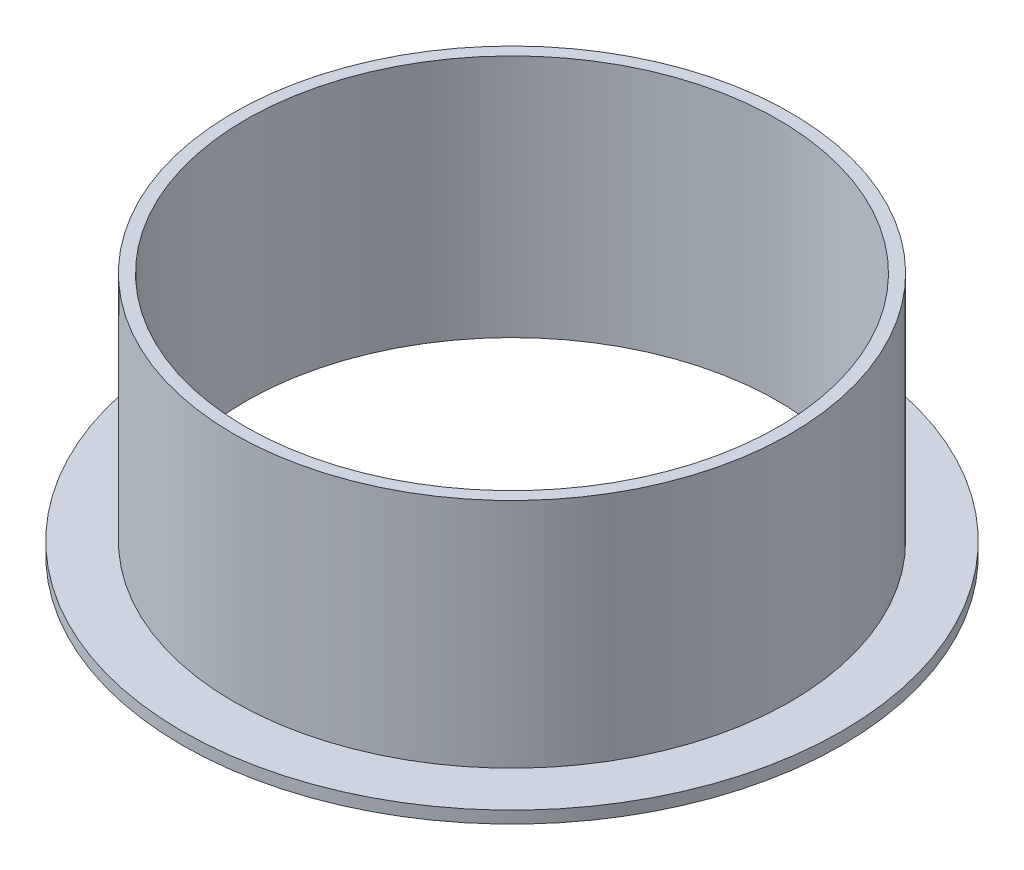
ISO-10303-21;
HEADER;
FILE_DESCRIPTION(('STEP AP214'),'2;1');
FILE_NAME('part.step','',(''),(''),'','','');
FILE_SCHEMA(('AUTOMOTIVE_DESIGN { 1 0 10303 214 1 1 1 1 }'));
ENDSEC;
DATA;
#1=APPLICATION_CONTEXT('core data for automotive mechanical design processes');
#2=APPLICATION_PROTOCOL_DEFINITION('international standard','automotive_design',2000,#1);
#3=PRODUCT_CONTEXT('',#1,'mechanical');
#4=PRODUCT('Part','Part','',(#3));
#5=PRODUCT_RELATED_PRODUCT_CATEGORY('part','',(#4));
#6=PRODUCT_DEFINITION_FORMATION('','',#4);
#7=PRODUCT_DEFINITION_CONTEXT('part definition',#1,'design');
#8=PRODUCT_DEFINITION('design','',#6,#7);
#9=PRODUCT_DEFINITION_SHAPE('','',#8);
#10=(LENGTH_UNIT() NAMED_UNIT(*) SI_UNIT(.MILLI.,.METRE.));
#11=(NAMED_UNIT(*) PLANE_ANGLE_UNIT() SI_UNIT($,.RADIAN.));
#12=(NAMED_UNIT(*) SI_UNIT($,.STERADIAN.) SOLID_ANGLE_UNIT());
#13=UNCERTAINTY_MEASURE_WITH_UNIT(LENGTH_MEASURE(1.E-05),#10,'distance_accuracy_value','');
#14=(GEOMETRIC_REPRESENTATION_CONTEXT(3) GLOBAL_UNCERTAINTY_ASSIGNED_CONTEXT((#13)) GLOBAL_UNIT_ASSIGNED_CONTEXT((#10,
#11,#12)) REPRESENTATION_CONTEXT('',''));
#15=CARTESIAN_POINT('',(0.,0.,0.));
#16=DIRECTION('',(0.,0.,1.));
#17=DIRECTION('',(1.,0.,0.));
#18=AXIS2_PLACEMENT_3D('',#15,#16,#17);
#19=CARTESIAN_POINT('',(0.,64.,0.));
#20=DIRECTION('',(0.,-1.,0.));
#21=DIRECTION('',(0.,0.,-1.));
#22=AXIS2_PLACEMENT_3D('',#19,#20,#21);
#23=CYLINDRICAL_SURFACE('',#22,69.85);
#24=CARTESIAN_POINT('',(0.,64.,0.));
#25=DIRECTION('',(0.,1.,0.));
#26=DIRECTION('',(0.,0.,1.));
#27=AXIS2_PLACEMENT_3D('',#24,#25,#26);
#28=CIRCLE('',#27,69.85);
#29=CARTESIAN_POINT('',(0.,64.,69.85));
#30=VERTEX_POINT('',#29);
#31=EDGE_CURVE('E43',#30,#30,#28,.T.);
#32=ORIENTED_EDGE('',*,*,#31,.T.);
#33=EDGE_LOOP('',(#32));
#34=FACE_BOUND('',#33,.T.);
#35=CARTESIAN_POINT('',(0.,0.,0.));
#36=DIRECTION('',(0.,1.,0.));
#37=DIRECTION('',(0.,0.,1.));
#38=AXIS2_PLACEMENT_3D('',#35,#36,#37);
#39=CIRCLE('',#38,69.85);
#40=CARTESIAN_POINT('',(0.,0.,69.85));
#41=VERTEX_POINT('',#40);
#42=EDGE_CURVE('E39',#41,#41,#39,.T.);
#43=ORIENTED_EDGE('',*,*,#42,.F.);
#44=EDGE_LOOP('',(#43));
#45=FACE_BOUND('',#44,.T.);
#46=ADVANCED_FACE('F36',(#34,#45),#23,.F.);
#47=CARTESIAN_POINT('',(0.,64.,0.));
#48=DIRECTION('',(0.,-1.,0.));
#49=DIRECTION('',(0.,0.,-1.));
#50=AXIS2_PLACEMENT_3D('',#47,#48,#49);
#51=CYLINDRICAL_SURFACE('',#50,73.025);
#52=CARTESIAN_POINT('',(0.,3.175,0.));
#53=DIRECTION('',(0.,1.,0.));
#54=DIRECTION('',(0.,0.,1.));
#55=AXIS2_PLACEMENT_3D('',#52,#53,#54);
#56=CIRCLE('',#55,73.025);
#57=CARTESIAN_POINT('',(0.,3.175,73.025));
#58=VERTEX_POINT('',#57);
#59=EDGE_CURVE('E52',#58,#58,#56,.T.);
#60=ORIENTED_EDGE('',*,*,#59,.T.);
#61=EDGE_LOOP('',(#60));
#62=FACE_BOUND('',#61,.T.);
#63=CARTESIAN_POINT('',(0.,64.,0.));
#64=DIRECTION('',(0.,1.,0.));
#65=DIRECTION('',(0.,0.,1.));
#66=AXIS2_PLACEMENT_3D('',#63,#64,#65);
#67=CIRCLE('',#66,73.025);
#68=CARTESIAN_POINT('',(0.,64.,73.025));
#69=VERTEX_POINT('',#68);
#70=EDGE_CURVE('E10',#69,#69,#67,.T.);
#71=ORIENTED_EDGE('',*,*,#70,.F.);
#72=EDGE_LOOP('',(#71));
#73=FACE_BOUND('',#72,.T.);
#74=ADVANCED_FACE('F59',(#62,#73),#51,.T.);
#75=CARTESIAN_POINT('',(0.,64.,0.));
#76=DIRECTION('',(0.,1.,0.));
#77=DIRECTION('',(0.,0.,1.));
#78=AXIS2_PLACEMENT_3D('',#75,#76,#77);
#79=PLANE('',#78);
#80=ORIENTED_EDGE('',*,*,#31,.F.);
#81=EDGE_LOOP('',(#80));
#82=FACE_BOUND('',#81,.T.);
#83=ORIENTED_EDGE('',*,*,#70,.T.);
#84=EDGE_LOOP('',(#83));
#85=FACE_BOUND('',#84,.T.);
#86=ADVANCED_FACE('F76',(#82,#85),#79,.T.);
#87=CARTESIAN_POINT('',(0.,0.,0.));
#88=DIRECTION('',(0.,1.,0.));
#89=DIRECTION('',(0.,0.,1.));
#90=AXIS2_PLACEMENT_3D('',#87,#88,#89);
#91=PLANE('',#90);
#92=ORIENTED_EDGE('',*,*,#42,.T.);
#93=EDGE_LOOP('',(#92));
#94=FACE_BOUND('',#93,.T.);
#95=CARTESIAN_POINT('',(0.,0.,0.));
#96=DIRECTION('',(0.,1.,0.));
#97=DIRECTION('',(0.,0.,1.));
#98=AXIS2_PLACEMENT_3D('',#95,#96,#97);
#99=CIRCLE('',#98,86.5);
#100=CARTESIAN_POINT('',(0.,0.,86.5));
#101=VERTEX_POINT('',#100);
#102=EDGE_CURVE('E49',#101,#101,#99,.T.);
#103=ORIENTED_EDGE('',*,*,#102,.F.);
#104=EDGE_LOOP('',(#103));
#105=FACE_BOUND('',#104,.T.);
#106=ADVANCED_FACE('F71',(#94,#105),#91,.F.);
#107=CARTESIAN_POINT('',(0.,3.175,0.));
#108=DIRECTION('',(0.,-1.,0.));
#109=DIRECTION('',(0.,0.,-1.));
#110=AXIS2_PLACEMENT_3D('',#107,#108,#109);
#111=CYLINDRICAL_SURFACE('',#110,86.5);
#112=CARTESIAN_POINT('',(0.,3.175,0.));
#113=DIRECTION('',(0.,1.,0.));
#114=DIRECTION('',(0.,0.,1.));
#115=AXIS2_PLACEMENT_3D('',#112,#113,#114);
#116=CIRCLE('',#115,86.5);
#117=CARTESIAN_POINT('',(0.,3.175,86.5));
#118=VERTEX_POINT('',#117);
#119=EDGE_CURVE('E53',#118,#118,#116,.T.);
#120=ORIENTED_EDGE('',*,*,#119,.F.);
#121=EDGE_LOOP('',(#120));
#122=FACE_BOUND('',#121,.T.);
#123=ORIENTED_EDGE('',*,*,#102,.T.);
#124=EDGE_LOOP('',(#123));
#125=FACE_BOUND('',#124,.T.);
#126=ADVANCED_FACE('F65',(#122,#125),#111,.T.);
#127=CARTESIAN_POINT('',(0.,3.175,0.));
#128=DIRECTION('',(0.,1.,0.));
#129=DIRECTION('',(0.,0.,1.));
#130=AXIS2_PLACEMENT_3D('',#127,#128,#129);
#131=PLANE('',#130);
#132=ORIENTED_EDGE('',*,*,#59,.F.);
#133=EDGE_LOOP('',(#132));
#134=FACE_BOUND('',#133,.T.);
#135=ORIENTED_EDGE('',*,*,#119,.T.);
#136=EDGE_LOOP('',(#135));
#137=FACE_BOUND('',#136,.T.);
#138=ADVANCED_FACE('F62',(#134,#137),#131,.T.);
#139=CLOSED_SHELL('',(#46,#74,#86,#106,#126,#138));
#140=MANIFOLD_SOLID_BREP('B2',#139);
#141=ADVANCED_BREP_SHAPE_REPRESENTATION('',(#18,#140),#14);
#142=SHAPE_DEFINITION_REPRESENTATION(#9,#141);
ENDSEC;
END-ISO-10303-21;
